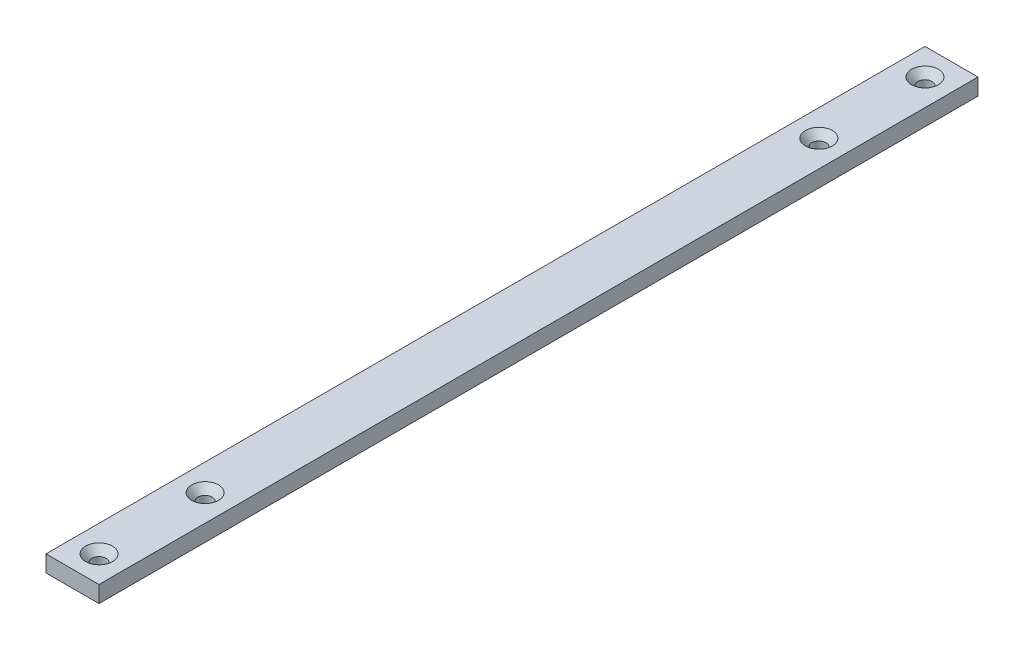
ISO-10303-21;
HEADER;
FILE_DESCRIPTION(('STEP AP214'),'2;1');
FILE_NAME('part.step','',(''),(''),'','','');
FILE_SCHEMA(('AUTOMOTIVE_DESIGN { 1 0 10303 214 1 1 1 1 }'));
ENDSEC;
DATA;
#1=APPLICATION_CONTEXT('core data for automotive mechanical design processes');
#2=APPLICATION_PROTOCOL_DEFINITION('international standard','automotive_design',2000,#1);
#3=PRODUCT_CONTEXT('',#1,'mechanical');
#4=PRODUCT('Part','Part','',(#3));
#5=PRODUCT_RELATED_PRODUCT_CATEGORY('part','',(#4));
#6=PRODUCT_DEFINITION_FORMATION('','',#4);
#7=PRODUCT_DEFINITION_CONTEXT('part definition',#1,'design');
#8=PRODUCT_DEFINITION('design','',#6,#7);
#9=PRODUCT_DEFINITION_SHAPE('','',#8);
#10=(LENGTH_UNIT() NAMED_UNIT(*) SI_UNIT(.MILLI.,.METRE.));
#11=(NAMED_UNIT(*) PLANE_ANGLE_UNIT() SI_UNIT($,.RADIAN.));
#12=(NAMED_UNIT(*) SI_UNIT($,.STERADIAN.) SOLID_ANGLE_UNIT());
#13=UNCERTAINTY_MEASURE_WITH_UNIT(LENGTH_MEASURE(1.E-05),#10,'distance_accuracy_value','');
#14=(GEOMETRIC_REPRESENTATION_CONTEXT(3) GLOBAL_UNCERTAINTY_ASSIGNED_CONTEXT((#13)) GLOBAL_UNIT_ASSIGNED_CONTEXT((#10,
#11,#12)) REPRESENTATION_CONTEXT('',''));
#15=CARTESIAN_POINT('',(0.,0.,0.));
#16=DIRECTION('',(0.,0.,1.));
#17=DIRECTION('',(1.,0.,0.));
#18=AXIS2_PLACEMENT_3D('',#15,#16,#17);
#19=CARTESIAN_POINT('',(-12.7,3.96875,210.5));
#20=DIRECTION('',(1.,0.,0.));
#21=DIRECTION('',(0.,0.,-1.));
#22=AXIS2_PLACEMENT_3D('',#19,#20,#21);
#23=PLANE('',#22);
#24=DIRECTION('',(0.,-1.,0.));
#25=VECTOR('',#24,1.);
#26=CARTESIAN_POINT('',(-12.7,3.96875,-210.5));
#27=LINE('',#26,#25);
#28=CARTESIAN_POINT('',(-12.7,3.96875,-210.5));
#29=VERTEX_POINT('',#28);
#30=CARTESIAN_POINT('',(-12.7,-3.96875,-210.5));
#31=VERTEX_POINT('',#30);
#32=EDGE_CURVE('E99',#29,#31,#27,.T.);
#33=ORIENTED_EDGE('',*,*,#32,.T.);
#34=DIRECTION('',(0.,0.,-1.));
#35=VECTOR('',#34,1.);
#36=CARTESIAN_POINT('',(-12.7,-3.96875,210.5));
#37=LINE('',#36,#35);
#38=CARTESIAN_POINT('',(-12.7,-3.96875,210.5));
#39=VERTEX_POINT('',#38);
#40=EDGE_CURVE('E11',#39,#31,#37,.T.);
#41=ORIENTED_EDGE('',*,*,#40,.F.);
#42=DIRECTION('',(0.,-1.,0.));
#43=VECTOR('',#42,1.);
#44=CARTESIAN_POINT('',(-12.7,3.96875,210.5));
#45=LINE('',#44,#43);
#46=CARTESIAN_POINT('',(-12.7,3.96875,210.5));
#47=VERTEX_POINT('',#46);
#48=EDGE_CURVE('E87',#47,#39,#45,.T.);
#49=ORIENTED_EDGE('',*,*,#48,.F.);
#50=DIRECTION('',(0.,0.,-1.));
#51=VECTOR('',#50,1.);
#52=CARTESIAN_POINT('',(-12.7,3.96875,210.5));
#53=LINE('',#52,#51);
#54=EDGE_CURVE('E95',#47,#29,#53,.T.);
#55=ORIENTED_EDGE('',*,*,#54,.T.);
#56=EDGE_LOOP('',(#33,#41,#49,#55));
#57=FACE_BOUND('',#56,.T.);
#58=ADVANCED_FACE('F36',(#57),#23,.F.);
#59=CARTESIAN_POINT('',(12.7,-3.96875,210.5));
#60=DIRECTION('',(0.,1.,0.));
#61=DIRECTION('',(0.,0.,1.));
#62=AXIS2_PLACEMENT_3D('',#59,#60,#61);
#63=PLANE('',#62);
#64=CARTESIAN_POINT('',(0.,-3.96875,-197.8));
#65=DIRECTION('',(0.,1.,0.));
#66=DIRECTION('',(0.,0.,1.));
#67=AXIS2_PLACEMENT_3D('',#64,#65,#66);
#68=CIRCLE('',#67,3.3782);
#69=CARTESIAN_POINT('',(0.,-3.96875,-194.4218));
#70=VERTEX_POINT('',#69);
#71=EDGE_CURVE('E139',#70,#70,#68,.T.);
#72=ORIENTED_EDGE('',*,*,#71,.T.);
#73=EDGE_LOOP('',(#72));
#74=FACE_BOUND('',#73,.T.);
#75=CARTESIAN_POINT('',(0.,-3.96875,197.8));
#76=DIRECTION('',(0.,1.,0.));
#77=DIRECTION('',(0.,0.,1.));
#78=AXIS2_PLACEMENT_3D('',#75,#76,#77);
#79=CIRCLE('',#78,3.3782);
#80=CARTESIAN_POINT('',(0.,-3.96875,201.1782));
#81=VERTEX_POINT('',#80);
#82=EDGE_CURVE('E130',#81,#81,#79,.T.);
#83=ORIENTED_EDGE('',*,*,#82,.T.);
#84=EDGE_LOOP('',(#83));
#85=FACE_BOUND('',#84,.T.);
#86=CARTESIAN_POINT('',(0.,-3.96875,-147.));
#87=DIRECTION('',(0.,1.,0.));
#88=DIRECTION('',(0.,0.,1.));
#89=AXIS2_PLACEMENT_3D('',#86,#87,#88);
#90=CIRCLE('',#89,3.3782);
#91=CARTESIAN_POINT('',(0.,-3.96875,-143.6218));
#92=VERTEX_POINT('',#91);
#93=EDGE_CURVE('E121',#92,#92,#90,.T.);
#94=ORIENTED_EDGE('',*,*,#93,.T.);
#95=EDGE_LOOP('',(#94));
#96=FACE_BOUND('',#95,.T.);
#97=CARTESIAN_POINT('',(0.,-3.96875,147.));
#98=DIRECTION('',(0.,1.,0.));
#99=DIRECTION('',(0.,0.,1.));
#100=AXIS2_PLACEMENT_3D('',#97,#98,#99);
#101=CIRCLE('',#100,3.3782);
#102=CARTESIAN_POINT('',(0.,-3.96875,150.3782));
#103=VERTEX_POINT('',#102);
#104=EDGE_CURVE('E102',#103,#103,#101,.T.);
#105=ORIENTED_EDGE('',*,*,#104,.T.);
#106=EDGE_LOOP('',(#105));
#107=FACE_BOUND('',#106,.T.);
#108=DIRECTION('',(1.,0.,0.));
#109=VECTOR('',#108,1.);
#110=CARTESIAN_POINT('',(12.7,-3.96875,-210.5));
#111=LINE('',#110,#109);
#112=CARTESIAN_POINT('',(12.7,-3.96875,-210.5));
#113=VERTEX_POINT('',#112);
#114=EDGE_CURVE('E91',#31,#113,#111,.T.);
#115=ORIENTED_EDGE('',*,*,#114,.T.);
#116=DIRECTION('',(0.,0.,-1.));
#117=VECTOR('',#116,1.);
#118=CARTESIAN_POINT('',(12.7,-3.96875,210.5));
#119=LINE('',#118,#117);
#120=CARTESIAN_POINT('',(12.7,-3.96875,210.5));
#121=VERTEX_POINT('',#120);
#122=EDGE_CURVE('E44',#121,#113,#119,.T.);
#123=ORIENTED_EDGE('',*,*,#122,.F.);
#124=DIRECTION('',(1.,0.,0.));
#125=VECTOR('',#124,1.);
#126=CARTESIAN_POINT('',(12.7,-3.96875,210.5));
#127=LINE('',#126,#125);
#128=EDGE_CURVE('E82',#39,#121,#127,.T.);
#129=ORIENTED_EDGE('',*,*,#128,.F.);
#130=ORIENTED_EDGE('',*,*,#40,.T.);
#131=EDGE_LOOP('',(#115,#123,#129,#130));
#132=FACE_BOUND('',#131,.T.);
#133=ADVANCED_FACE('F90',(#74,#85,#96,#107,#132),#63,.F.);
#134=CARTESIAN_POINT('',(12.7,3.96875,210.5));
#135=DIRECTION('',(-1.,0.,0.));
#136=DIRECTION('',(0.,0.,1.));
#137=AXIS2_PLACEMENT_3D('',#134,#135,#136);
#138=PLANE('',#137);
#139=DIRECTION('',(0.,1.,0.));
#140=VECTOR('',#139,1.);
#141=CARTESIAN_POINT('',(12.7,3.96875,-210.5));
#142=LINE('',#141,#140);
#143=CARTESIAN_POINT('',(12.7,3.96875,-210.5));
#144=VERTEX_POINT('',#143);
#145=EDGE_CURVE('E69',#113,#144,#142,.T.);
#146=ORIENTED_EDGE('',*,*,#145,.T.);
#147=DIRECTION('',(0.,0.,-1.));
#148=VECTOR('',#147,1.);
#149=CARTESIAN_POINT('',(12.7,3.96875,210.5));
#150=LINE('',#149,#148);
#151=CARTESIAN_POINT('',(12.7,3.96875,210.5));
#152=VERTEX_POINT('',#151);
#153=EDGE_CURVE('E92',#152,#144,#150,.T.);
#154=ORIENTED_EDGE('',*,*,#153,.F.);
#155=DIRECTION('',(0.,1.,0.));
#156=VECTOR('',#155,1.);
#157=CARTESIAN_POINT('',(12.7,3.96875,210.5));
#158=LINE('',#157,#156);
#159=EDGE_CURVE('E85',#121,#152,#158,.T.);
#160=ORIENTED_EDGE('',*,*,#159,.F.);
#161=ORIENTED_EDGE('',*,*,#122,.T.);
#162=EDGE_LOOP('',(#146,#154,#160,#161));
#163=FACE_BOUND('',#162,.T.);
#164=ADVANCED_FACE('F93',(#163),#138,.F.);
#165=CARTESIAN_POINT('',(12.7,3.96875,210.5));
#166=DIRECTION('',(0.,-1.,0.));
#167=DIRECTION('',(0.,0.,-1.));
#168=AXIS2_PLACEMENT_3D('',#165,#166,#167);
#169=PLANE('',#168);
#170=CARTESIAN_POINT('',(0.,3.96875,-197.8));
#171=DIRECTION('',(0.,1.,0.));
#172=DIRECTION('',(0.,0.,1.));
#173=AXIS2_PLACEMENT_3D('',#170,#171,#172);
#174=CIRCLE('',#173,6.4389);
#175=CARTESIAN_POINT('',(0.,3.96875,-191.3611));
#176=VERTEX_POINT('',#175);
#177=EDGE_CURVE('E145',#176,#176,#174,.T.);
#178=ORIENTED_EDGE('',*,*,#177,.F.);
#179=EDGE_LOOP('',(#178));
#180=FACE_BOUND('',#179,.T.);
#181=CARTESIAN_POINT('',(0.,3.96875,197.8));
#182=DIRECTION('',(0.,1.,0.));
#183=DIRECTION('',(0.,0.,1.));
#184=AXIS2_PLACEMENT_3D('',#181,#182,#183);
#185=CIRCLE('',#184,6.4389);
#186=CARTESIAN_POINT('',(0.,3.96875,204.2389));
#187=VERTEX_POINT('',#186);
#188=EDGE_CURVE('E136',#187,#187,#185,.T.);
#189=ORIENTED_EDGE('',*,*,#188,.F.);
#190=EDGE_LOOP('',(#189));
#191=FACE_BOUND('',#190,.T.);
#192=CARTESIAN_POINT('',(0.,3.96875,-147.));
#193=DIRECTION('',(0.,1.,0.));
#194=DIRECTION('',(0.,0.,1.));
#195=AXIS2_PLACEMENT_3D('',#192,#193,#194);
#196=CIRCLE('',#195,6.4389);
#197=CARTESIAN_POINT('',(0.,3.96875,-140.5611));
#198=VERTEX_POINT('',#197);
#199=EDGE_CURVE('E127',#198,#198,#196,.T.);
#200=ORIENTED_EDGE('',*,*,#199,.F.);
#201=EDGE_LOOP('',(#200));
#202=FACE_BOUND('',#201,.T.);
#203=CARTESIAN_POINT('',(0.,3.96875,147.));
#204=DIRECTION('',(0.,1.,0.));
#205=DIRECTION('',(0.,0.,1.));
#206=AXIS2_PLACEMENT_3D('',#203,#204,#205);
#207=CIRCLE('',#206,6.4389);
#208=CARTESIAN_POINT('',(0.,3.96875,153.4389));
#209=VERTEX_POINT('',#208);
#210=EDGE_CURVE('E118',#209,#209,#207,.T.);
#211=ORIENTED_EDGE('',*,*,#210,.F.);
#212=EDGE_LOOP('',(#211));
#213=FACE_BOUND('',#212,.T.);
#214=DIRECTION('',(-1.,0.,0.));
#215=VECTOR('',#214,1.);
#216=CARTESIAN_POINT('',(12.7,3.96875,-210.5));
#217=LINE('',#216,#215);
#218=EDGE_CURVE('E75',#144,#29,#217,.T.);
#219=ORIENTED_EDGE('',*,*,#218,.T.);
#220=ORIENTED_EDGE('',*,*,#54,.F.);
#221=DIRECTION('',(-1.,0.,0.));
#222=VECTOR('',#221,1.);
#223=CARTESIAN_POINT('',(12.7,3.96875,210.5));
#224=LINE('',#223,#222);
#225=EDGE_CURVE('E52',#152,#47,#224,.T.);
#226=ORIENTED_EDGE('',*,*,#225,.F.);
#227=ORIENTED_EDGE('',*,*,#153,.T.);
#228=EDGE_LOOP('',(#219,#220,#226,#227));
#229=FACE_BOUND('',#228,.T.);
#230=ADVANCED_FACE('F107',(#180,#191,#202,#213,#229),#169,.F.);
#231=CARTESIAN_POINT('',(0.,0.,210.5));
#232=DIRECTION('',(0.,0.,-1.));
#233=DIRECTION('',(-1.,0.,0.));
#234=AXIS2_PLACEMENT_3D('',#231,#232,#233);
#235=PLANE('',#234);
#236=ORIENTED_EDGE('',*,*,#48,.T.);
#237=ORIENTED_EDGE('',*,*,#128,.T.);
#238=ORIENTED_EDGE('',*,*,#159,.T.);
#239=ORIENTED_EDGE('',*,*,#225,.T.);
#240=EDGE_LOOP('',(#236,#237,#238,#239));
#241=FACE_BOUND('',#240,.T.);
#242=ADVANCED_FACE('F83',(#241),#235,.F.);
#243=CARTESIAN_POINT('',(0.,0.,-210.5));
#244=DIRECTION('',(0.,0.,-1.));
#245=DIRECTION('',(-1.,0.,0.));
#246=AXIS2_PLACEMENT_3D('',#243,#244,#245);
#247=PLANE('',#246);
#248=ORIENTED_EDGE('',*,*,#32,.F.);
#249=ORIENTED_EDGE('',*,*,#218,.F.);
#250=ORIENTED_EDGE('',*,*,#145,.F.);
#251=ORIENTED_EDGE('',*,*,#114,.F.);
#252=EDGE_LOOP('',(#248,#249,#250,#251));
#253=FACE_BOUND('',#252,.T.);
#254=ADVANCED_FACE('F110',(#253),#247,.T.);
#255=CARTESIAN_POINT('',(0.,3.96875,147.));
#256=DIRECTION('',(0.,1.,0.));
#257=DIRECTION('',(0.,0.,1.));
#258=AXIS2_PLACEMENT_3D('',#255,#256,#257);
#259=CYLINDRICAL_SURFACE('',#258,3.3782);
#260=ORIENTED_EDGE('',*,*,#104,.F.);
#261=EDGE_LOOP('',(#260));
#262=FACE_BOUND('',#261,.T.);
#263=CARTESIAN_POINT('',(0.,0.447817416018657,147.));
#264=DIRECTION('',(0.,1.,0.));
#265=DIRECTION('',(0.,0.,1.));
#266=AXIS2_PLACEMENT_3D('',#263,#264,#265);
#267=CIRCLE('',#266,3.3782);
#268=CARTESIAN_POINT('',(0.,0.447817416018657,150.3782));
#269=VERTEX_POINT('',#268);
#270=EDGE_CURVE('E115',#269,#269,#267,.T.);
#271=ORIENTED_EDGE('',*,*,#270,.T.);
#272=EDGE_LOOP('',(#271));
#273=FACE_BOUND('',#272,.T.);
#274=ADVANCED_FACE('F163',(#262,#273),#259,.F.);
#275=CARTESIAN_POINT('',(0.,3.96875,147.));
#276=DIRECTION('',(0.,1.,0.));
#277=DIRECTION('',(0.,0.,1.));
#278=AXIS2_PLACEMENT_3D('',#275,#276,#277);
#279=CONICAL_SURFACE('',#278,6.4389,0.715584993317675);
#280=ORIENTED_EDGE('',*,*,#270,.F.);
#281=EDGE_LOOP('',(#280));
#282=FACE_BOUND('',#281,.T.);
#283=ORIENTED_EDGE('',*,*,#210,.T.);
#284=EDGE_LOOP('',(#283));
#285=FACE_BOUND('',#284,.T.);
#286=ADVANCED_FACE('F160',(#282,#285),#279,.F.);
#287=CARTESIAN_POINT('',(0.,3.96875,-147.));
#288=DIRECTION('',(0.,1.,0.));
#289=DIRECTION('',(0.,0.,1.));
#290=AXIS2_PLACEMENT_3D('',#287,#288,#289);
#291=CYLINDRICAL_SURFACE('',#290,3.3782);
#292=ORIENTED_EDGE('',*,*,#93,.F.);
#293=EDGE_LOOP('',(#292));
#294=FACE_BOUND('',#293,.T.);
#295=CARTESIAN_POINT('',(0.,0.447817416018657,-147.));
#296=DIRECTION('',(0.,1.,0.));
#297=DIRECTION('',(0.,0.,1.));
#298=AXIS2_PLACEMENT_3D('',#295,#296,#297);
#299=CIRCLE('',#298,3.3782);
#300=CARTESIAN_POINT('',(0.,0.447817416018657,-143.6218));
#301=VERTEX_POINT('',#300);
#302=EDGE_CURVE('E124',#301,#301,#299,.T.);
#303=ORIENTED_EDGE('',*,*,#302,.T.);
#304=EDGE_LOOP('',(#303));
#305=FACE_BOUND('',#304,.T.);
#306=ADVANCED_FACE('F162',(#294,#305),#291,.F.);
#307=CARTESIAN_POINT('',(0.,3.96875,-147.));
#308=DIRECTION('',(0.,1.,0.));
#309=DIRECTION('',(0.,0.,1.));
#310=AXIS2_PLACEMENT_3D('',#307,#308,#309);
#311=CONICAL_SURFACE('',#310,6.4389,0.715584993317675);
#312=ORIENTED_EDGE('',*,*,#302,.F.);
#313=EDGE_LOOP('',(#312));
#314=FACE_BOUND('',#313,.T.);
#315=ORIENTED_EDGE('',*,*,#199,.T.);
#316=EDGE_LOOP('',(#315));
#317=FACE_BOUND('',#316,.T.);
#318=ADVANCED_FACE('F170',(#314,#317),#311,.F.);
#319=CARTESIAN_POINT('',(0.,3.96875,197.8));
#320=DIRECTION('',(0.,1.,0.));
#321=DIRECTION('',(0.,0.,1.));
#322=AXIS2_PLACEMENT_3D('',#319,#320,#321);
#323=CYLINDRICAL_SURFACE('',#322,3.3782);
#324=ORIENTED_EDGE('',*,*,#82,.F.);
#325=EDGE_LOOP('',(#324));
#326=FACE_BOUND('',#325,.T.);
#327=CARTESIAN_POINT('',(0.,0.447817416018657,197.8));
#328=DIRECTION('',(0.,1.,0.));
#329=DIRECTION('',(0.,0.,1.));
#330=AXIS2_PLACEMENT_3D('',#327,#328,#329);
#331=CIRCLE('',#330,3.3782);
#332=CARTESIAN_POINT('',(0.,0.447817416018657,201.1782));
#333=VERTEX_POINT('',#332);
#334=EDGE_CURVE('E133',#333,#333,#331,.T.);
#335=ORIENTED_EDGE('',*,*,#334,.T.);
#336=EDGE_LOOP('',(#335));
#337=FACE_BOUND('',#336,.T.);
#338=ADVANCED_FACE('F224',(#326,#337),#323,.F.);
#339=CARTESIAN_POINT('',(0.,3.96875,197.8));
#340=DIRECTION('',(0.,1.,0.));
#341=DIRECTION('',(0.,0.,1.));
#342=AXIS2_PLACEMENT_3D('',#339,#340,#341);
#343=CONICAL_SURFACE('',#342,6.4389,0.715584993317675);
#344=ORIENTED_EDGE('',*,*,#334,.F.);
#345=EDGE_LOOP('',(#344));
#346=FACE_BOUND('',#345,.T.);
#347=ORIENTED_EDGE('',*,*,#188,.T.);
#348=EDGE_LOOP('',(#347));
#349=FACE_BOUND('',#348,.T.);
#350=ADVANCED_FACE('F234',(#346,#349),#343,.F.);
#351=CARTESIAN_POINT('',(0.,3.96875,-197.8));
#352=DIRECTION('',(0.,1.,0.));
#353=DIRECTION('',(0.,0.,1.));
#354=AXIS2_PLACEMENT_3D('',#351,#352,#353);
#355=CYLINDRICAL_SURFACE('',#354,3.3782);
#356=ORIENTED_EDGE('',*,*,#71,.F.);
#357=EDGE_LOOP('',(#356));
#358=FACE_BOUND('',#357,.T.);
#359=CARTESIAN_POINT('',(0.,0.447817416018657,-197.8));
#360=DIRECTION('',(0.,1.,0.));
#361=DIRECTION('',(0.,0.,1.));
#362=AXIS2_PLACEMENT_3D('',#359,#360,#361);
#363=CIRCLE('',#362,3.3782);
#364=CARTESIAN_POINT('',(0.,0.447817416018657,-194.4218));
#365=VERTEX_POINT('',#364);
#366=EDGE_CURVE('E142',#365,#365,#363,.T.);
#367=ORIENTED_EDGE('',*,*,#366,.T.);
#368=EDGE_LOOP('',(#367));
#369=FACE_BOUND('',#368,.T.);
#370=ADVANCED_FACE('F244',(#358,#369),#355,.F.);
#371=CARTESIAN_POINT('',(0.,3.96875,-197.8));
#372=DIRECTION('',(0.,1.,0.));
#373=DIRECTION('',(0.,0.,1.));
#374=AXIS2_PLACEMENT_3D('',#371,#372,#373);
#375=CONICAL_SURFACE('',#374,6.4389,0.715584993317675);
#376=ORIENTED_EDGE('',*,*,#366,.F.);
#377=EDGE_LOOP('',(#376));
#378=FACE_BOUND('',#377,.T.);
#379=ORIENTED_EDGE('',*,*,#177,.T.);
#380=EDGE_LOOP('',(#379));
#381=FACE_BOUND('',#380,.T.);
#382=ADVANCED_FACE('F149',(#378,#381),#375,.F.);
#383=CLOSED_SHELL('',(#58,#133,#164,#230,#242,#254,#274,#286,#306,#318,#338,#350,#370,#382));
#384=MANIFOLD_SOLID_BREP('B2',#383);
#385=ADVANCED_BREP_SHAPE_REPRESENTATION('',(#18,#384),#14);
#386=SHAPE_DEFINITION_REPRESENTATION(#9,#385);
ENDSEC;
END-ISO-10303-21;
